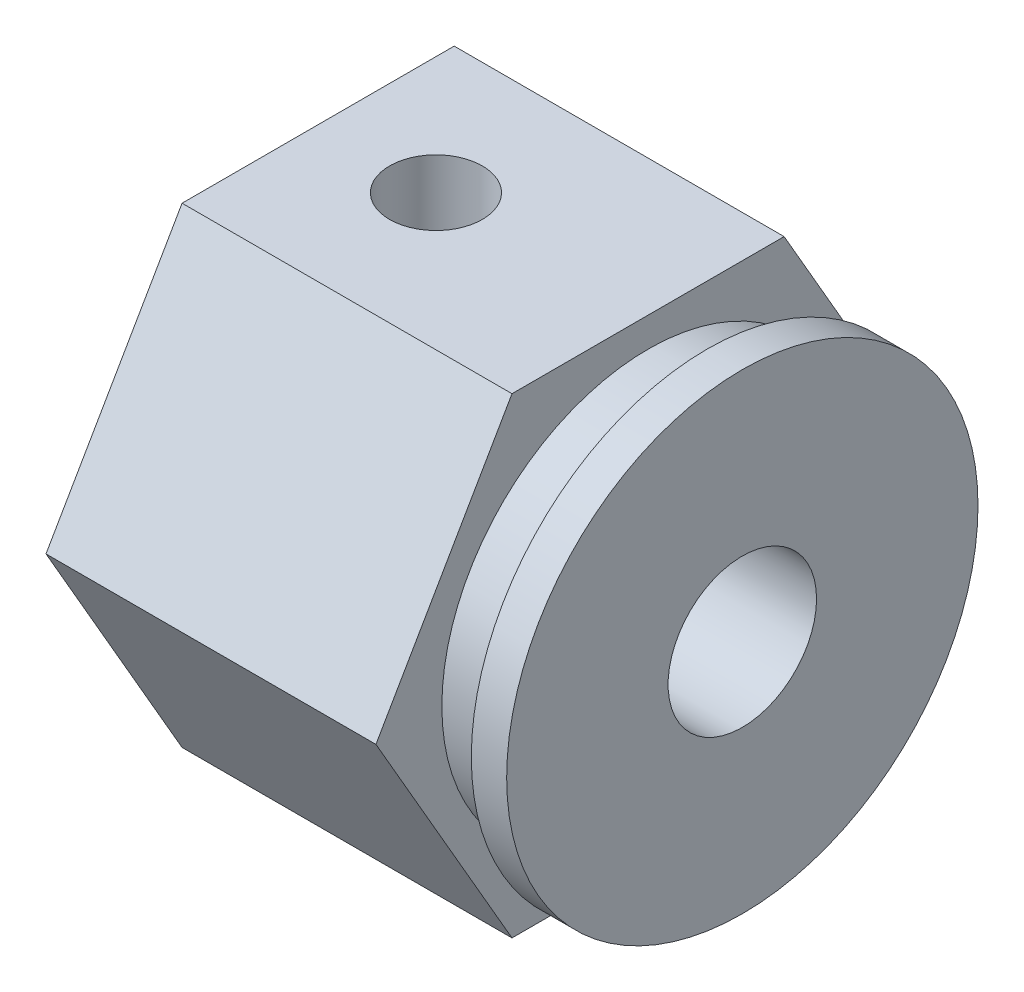
ISO-10303-21;
HEADER;
FILE_DESCRIPTION(('STEP AP214'),'2;1');
FILE_NAME('part.step','',(''),(''),'','','');
FILE_SCHEMA(('AUTOMOTIVE_DESIGN { 1 0 10303 214 1 1 1 1 }'));
ENDSEC;
DATA;
#1=APPLICATION_CONTEXT('core data for automotive mechanical design processes');
#2=APPLICATION_PROTOCOL_DEFINITION('international standard','automotive_design',2000,#1);
#3=PRODUCT_CONTEXT('',#1,'mechanical');
#4=PRODUCT('Part','Part','',(#3));
#5=PRODUCT_RELATED_PRODUCT_CATEGORY('part','',(#4));
#6=PRODUCT_DEFINITION_FORMATION('','',#4);
#7=PRODUCT_DEFINITION_CONTEXT('part definition',#1,'design');
#8=PRODUCT_DEFINITION('design','',#6,#7);
#9=PRODUCT_DEFINITION_SHAPE('','',#8);
#10=(LENGTH_UNIT() NAMED_UNIT(*) SI_UNIT(.MILLI.,.METRE.));
#11=(NAMED_UNIT(*) PLANE_ANGLE_UNIT() SI_UNIT($,.RADIAN.));
#12=(NAMED_UNIT(*) SI_UNIT($,.STERADIAN.) SOLID_ANGLE_UNIT());
#13=UNCERTAINTY_MEASURE_WITH_UNIT(LENGTH_MEASURE(1.E-05),#10,'distance_accuracy_value','');
#14=(GEOMETRIC_REPRESENTATION_CONTEXT(3) GLOBAL_UNCERTAINTY_ASSIGNED_CONTEXT((#13)) GLOBAL_UNIT_ASSIGNED_CONTEXT((#10,
#11,#12)) REPRESENTATION_CONTEXT('',''));
#15=CARTESIAN_POINT('',(0.,0.,0.));
#16=DIRECTION('',(0.,0.,1.));
#17=DIRECTION('',(1.,0.,0.));
#18=AXIS2_PLACEMENT_3D('',#15,#16,#17);
#19=CARTESIAN_POINT('',(8.89,-6.34999999999993,-3.66617420935418));
#20=DIRECTION('',(0.,0.499999999999995,0.866025403784442));
#21=DIRECTION('',(0.,-0.866025403784442,0.499999999999995));
#22=AXIS2_PLACEMENT_3D('',#19,#20,#21);
#23=PLANE('',#22);
#24=DIRECTION('',(0.,0.866025403784442,-0.499999999999995));
#25=VECTOR('',#24,1.);
#26=CARTESIAN_POINT('',(0.,-6.34999999999993,-3.66617420935418));
#27=LINE('',#26,#25);
#28=CARTESIAN_POINT('',(0.,-6.34999999999993,-3.66617420935418));
#29=VERTEX_POINT('',#28);
#30=CARTESIAN_POINT('',(0.,0.,-7.33234841870822));
#31=VERTEX_POINT('',#30);
#32=EDGE_CURVE('E123',#29,#31,#27,.T.);
#33=ORIENTED_EDGE('',*,*,#32,.T.);
#34=DIRECTION('',(-1.,0.,0.));
#35=VECTOR('',#34,1.);
#36=CARTESIAN_POINT('',(8.89,0.,-7.33234841870822));
#37=LINE('',#36,#35);
#38=CARTESIAN_POINT('',(8.89,0.,-7.33234841870822));
#39=VERTEX_POINT('',#38);
#40=EDGE_CURVE('E11',#39,#31,#37,.T.);
#41=ORIENTED_EDGE('',*,*,#40,.F.);
#42=DIRECTION('',(0.,0.866025403784442,-0.499999999999995));
#43=VECTOR('',#42,1.);
#44=CARTESIAN_POINT('',(8.89,-6.34999999999993,-3.66617420935418));
#45=LINE('',#44,#43);
#46=CARTESIAN_POINT('',(8.89,-6.34999999999993,-3.66617420935418));
#47=VERTEX_POINT('',#46);
#48=EDGE_CURVE('E90',#47,#39,#45,.T.);
#49=ORIENTED_EDGE('',*,*,#48,.F.);
#50=DIRECTION('',(-1.,0.,0.));
#51=VECTOR('',#50,1.);
#52=CARTESIAN_POINT('',(8.89,-6.34999999999993,-3.66617420935418));
#53=LINE('',#52,#51);
#54=EDGE_CURVE('E119',#47,#29,#53,.T.);
#55=ORIENTED_EDGE('',*,*,#54,.T.);
#56=EDGE_LOOP('',(#33,#41,#49,#55));
#57=FACE_BOUND('',#56,.T.);
#58=ADVANCED_FACE('F32',(#57),#23,.F.);
#59=CARTESIAN_POINT('',(8.89,0.,-7.33234841870822));
#60=DIRECTION('',(0.,-0.500000000000001,0.866025403784438));
#61=DIRECTION('',(0.,-0.866025403784438,-0.500000000000001));
#62=AXIS2_PLACEMENT_3D('',#59,#60,#61);
#63=PLANE('',#62);
#64=DIRECTION('',(0.,0.866025403784438,0.500000000000001));
#65=VECTOR('',#64,1.);
#66=CARTESIAN_POINT('',(0.,0.,-7.33234841870822));
#67=LINE('',#66,#65);
#68=CARTESIAN_POINT('',(0.,6.34999999999998,-3.66617420935409));
#69=VERTEX_POINT('',#68);
#70=EDGE_CURVE('E126',#31,#69,#67,.T.);
#71=ORIENTED_EDGE('',*,*,#70,.T.);
#72=DIRECTION('',(-1.,0.,0.));
#73=VECTOR('',#72,1.);
#74=CARTESIAN_POINT('',(8.89,6.34999999999998,-3.66617420935409));
#75=LINE('',#74,#73);
#76=CARTESIAN_POINT('',(8.89,6.34999999999998,-3.66617420935409));
#77=VERTEX_POINT('',#76);
#78=EDGE_CURVE('E46',#77,#69,#75,.T.);
#79=ORIENTED_EDGE('',*,*,#78,.F.);
#80=DIRECTION('',(0.,0.866025403784438,0.500000000000001));
#81=VECTOR('',#80,1.);
#82=CARTESIAN_POINT('',(8.89,0.,-7.33234841870822));
#83=LINE('',#82,#81);
#84=EDGE_CURVE('E173',#39,#77,#83,.T.);
#85=ORIENTED_EDGE('',*,*,#84,.F.);
#86=ORIENTED_EDGE('',*,*,#40,.T.);
#87=EDGE_LOOP('',(#71,#79,#85,#86));
#88=FACE_BOUND('',#87,.T.);
#89=ADVANCED_FACE('F160',(#88),#63,.F.);
#90=CARTESIAN_POINT('',(8.89,6.34999999999998,-3.66617420935409));
#91=DIRECTION('',(0.,-1.,0.));
#92=DIRECTION('',(0.,0.,-1.));
#93=AXIS2_PLACEMENT_3D('',#90,#91,#92);
#94=PLANE('',#93);
#95=CARTESIAN_POINT('',(3.175,6.34999999999997,0.));
#96=DIRECTION('',(0.,1.,0.));
#97=DIRECTION('',(0.,0.,1.));
#98=AXIS2_PLACEMENT_3D('',#95,#96,#97);
#99=CIRCLE('',#98,1.25);
#100=CARTESIAN_POINT('',(3.175,6.34999999999997,1.25000000000002));
#101=VERTEX_POINT('',#100);
#102=EDGE_CURVE('E143',#101,#101,#99,.T.);
#103=ORIENTED_EDGE('',*,*,#102,.F.);
#104=EDGE_LOOP('',(#103));
#105=FACE_BOUND('',#104,.T.);
#106=DIRECTION('',(0.,0.,1.));
#107=VECTOR('',#106,1.);
#108=CARTESIAN_POINT('',(0.,6.34999999999998,-3.66617420935409));
#109=LINE('',#108,#107);
#110=CARTESIAN_POINT('',(0.,6.34999999999996,3.66617420935414));
#111=VERTEX_POINT('',#110);
#112=EDGE_CURVE('E129',#69,#111,#109,.T.);
#113=ORIENTED_EDGE('',*,*,#112,.T.);
#114=DIRECTION('',(-1.,0.,0.));
#115=VECTOR('',#114,1.);
#116=CARTESIAN_POINT('',(8.89,6.34999999999996,3.66617420935414));
#117=LINE('',#116,#115);
#118=CARTESIAN_POINT('',(8.89,6.34999999999996,3.66617420935414));
#119=VERTEX_POINT('',#118);
#120=EDGE_CURVE('E114',#119,#111,#117,.T.);
#121=ORIENTED_EDGE('',*,*,#120,.F.);
#122=DIRECTION('',(0.,0.,1.));
#123=VECTOR('',#122,1.);
#124=CARTESIAN_POINT('',(8.89,6.34999999999998,-3.66617420935409));
#125=LINE('',#124,#123);
#126=EDGE_CURVE('E105',#77,#119,#125,.T.);
#127=ORIENTED_EDGE('',*,*,#126,.F.);
#128=ORIENTED_EDGE('',*,*,#78,.T.);
#129=EDGE_LOOP('',(#113,#121,#127,#128));
#130=FACE_BOUND('',#129,.T.);
#131=ADVANCED_FACE('F165',(#105,#130),#94,.F.);
#132=CARTESIAN_POINT('',(8.89,6.34999999999996,3.66617420935414));
#133=DIRECTION('',(0.,-0.499999999999995,-0.866025403784441));
#134=DIRECTION('',(0.,0.866025403784442,-0.499999999999995));
#135=AXIS2_PLACEMENT_3D('',#132,#133,#134);
#136=PLANE('',#135);
#137=DIRECTION('',(0.,-0.866025403784441,0.499999999999995));
#138=VECTOR('',#137,1.);
#139=CARTESIAN_POINT('',(0.,6.34999999999996,3.66617420935414));
#140=LINE('',#139,#138);
#141=CARTESIAN_POINT('',(0.,0.,7.33234841870822));
#142=VERTEX_POINT('',#141);
#143=EDGE_CURVE('E113',#111,#142,#140,.T.);
#144=ORIENTED_EDGE('',*,*,#143,.T.);
#145=DIRECTION('',(-1.,0.,0.));
#146=VECTOR('',#145,1.);
#147=CARTESIAN_POINT('',(8.89,0.,7.33234841870822));
#148=LINE('',#147,#146);
#149=CARTESIAN_POINT('',(8.89,0.,7.33234841870822));
#150=VERTEX_POINT('',#149);
#151=EDGE_CURVE('E110',#150,#142,#148,.T.);
#152=ORIENTED_EDGE('',*,*,#151,.F.);
#153=DIRECTION('',(0.,-0.866025403784441,0.499999999999995));
#154=VECTOR('',#153,1.);
#155=CARTESIAN_POINT('',(8.89,6.34999999999996,3.66617420935414));
#156=LINE('',#155,#154);
#157=EDGE_CURVE('E98',#119,#150,#156,.T.);
#158=ORIENTED_EDGE('',*,*,#157,.F.);
#159=ORIENTED_EDGE('',*,*,#120,.T.);
#160=EDGE_LOOP('',(#144,#152,#158,#159));
#161=FACE_BOUND('',#160,.T.);
#162=ADVANCED_FACE('F111',(#161),#136,.F.);
#163=CARTESIAN_POINT('',(8.89,0.,7.33234841870822));
#164=DIRECTION('',(0.,0.500000000000007,-0.866025403784434));
#165=DIRECTION('',(0.,0.866025403784435,0.500000000000007));
#166=AXIS2_PLACEMENT_3D('',#163,#164,#165);
#167=PLANE('',#166);
#168=DIRECTION('',(0.,-0.866025403784434,-0.500000000000007));
#169=VECTOR('',#168,1.);
#170=CARTESIAN_POINT('',(0.,0.,7.33234841870822));
#171=LINE('',#170,#169);
#172=CARTESIAN_POINT('',(0.,-6.35000000000001,3.66617420935405));
#173=VERTEX_POINT('',#172);
#174=EDGE_CURVE('E78',#142,#173,#171,.T.);
#175=ORIENTED_EDGE('',*,*,#174,.T.);
#176=DIRECTION('',(-1.,0.,0.));
#177=VECTOR('',#176,1.);
#178=CARTESIAN_POINT('',(8.89,-6.35000000000001,3.66617420935405));
#179=LINE('',#178,#177);
#180=CARTESIAN_POINT('',(8.89,-6.35000000000001,3.66617420935405));
#181=VERTEX_POINT('',#180);
#182=EDGE_CURVE('E115',#181,#173,#179,.T.);
#183=ORIENTED_EDGE('',*,*,#182,.F.);
#184=DIRECTION('',(0.,-0.866025403784434,-0.500000000000007));
#185=VECTOR('',#184,1.);
#186=CARTESIAN_POINT('',(8.89,0.,7.33234841870822));
#187=LINE('',#186,#185);
#188=EDGE_CURVE('E103',#150,#181,#187,.T.);
#189=ORIENTED_EDGE('',*,*,#188,.F.);
#190=ORIENTED_EDGE('',*,*,#151,.T.);
#191=EDGE_LOOP('',(#175,#183,#189,#190));
#192=FACE_BOUND('',#191,.T.);
#193=ADVANCED_FACE('F117',(#192),#167,.F.);
#194=CARTESIAN_POINT('',(8.89,-6.35000000000001,3.66617420935405));
#195=DIRECTION('',(0.,1.,0.));
#196=DIRECTION('',(0.,0.,1.));
#197=AXIS2_PLACEMENT_3D('',#194,#195,#196);
#198=PLANE('',#197);
#199=CARTESIAN_POINT('',(3.175,-6.35000000000004,0.));
#200=DIRECTION('',(0.,1.,0.));
#201=DIRECTION('',(0.,0.,1.));
#202=AXIS2_PLACEMENT_3D('',#199,#200,#201);
#203=CIRCLE('',#202,1.25);
#204=CARTESIAN_POINT('',(3.175,-6.35000000000004,1.24999999999998));
#205=VERTEX_POINT('',#204);
#206=EDGE_CURVE('E196',#205,#205,#203,.T.);
#207=ORIENTED_EDGE('',*,*,#206,.T.);
#208=EDGE_LOOP('',(#207));
#209=FACE_BOUND('',#208,.T.);
#210=DIRECTION('',(0.,0.,-1.));
#211=VECTOR('',#210,1.);
#212=CARTESIAN_POINT('',(0.,-6.35000000000001,3.66617420935405));
#213=LINE('',#212,#211);
#214=EDGE_CURVE('E84',#173,#29,#213,.T.);
#215=ORIENTED_EDGE('',*,*,#214,.T.);
#216=ORIENTED_EDGE('',*,*,#54,.F.);
#217=DIRECTION('',(0.,0.,-1.));
#218=VECTOR('',#217,1.);
#219=CARTESIAN_POINT('',(8.89,-6.35000000000001,3.66617420935405));
#220=LINE('',#219,#218);
#221=EDGE_CURVE('E55',#181,#47,#220,.T.);
#222=ORIENTED_EDGE('',*,*,#221,.F.);
#223=ORIENTED_EDGE('',*,*,#182,.T.);
#224=EDGE_LOOP('',(#215,#216,#222,#223));
#225=FACE_BOUND('',#224,.T.);
#226=ADVANCED_FACE('F199',(#209,#225),#198,.F.);
#227=CARTESIAN_POINT('',(8.89,0.,0.));
#228=DIRECTION('',(1.,0.,0.));
#229=DIRECTION('',(0.,0.,-1.));
#230=AXIS2_PLACEMENT_3D('',#227,#228,#229);
#231=PLANE('',#230);
#232=ORIENTED_EDGE('',*,*,#84,.T.);
#233=ORIENTED_EDGE('',*,*,#126,.T.);
#234=ORIENTED_EDGE('',*,*,#157,.T.);
#235=ORIENTED_EDGE('',*,*,#188,.T.);
#236=ORIENTED_EDGE('',*,*,#221,.T.);
#237=ORIENTED_EDGE('',*,*,#48,.T.);
#238=EDGE_LOOP('',(#232,#233,#234,#235,#236,#237));
#239=FACE_BOUND('',#238,.T.);
#240=CARTESIAN_POINT('',(8.89,0.,0.));
#241=DIRECTION('',(-1.,0.,0.));
#242=DIRECTION('',(0.,0.,1.));
#243=AXIS2_PLACEMENT_3D('',#240,#241,#242);
#244=CIRCLE('',#243,5.55624999999996);
#245=CARTESIAN_POINT('',(8.89,0.,5.55624999999996));
#246=VERTEX_POINT('',#245);
#247=EDGE_CURVE('E179',#246,#246,#244,.T.);
#248=ORIENTED_EDGE('',*,*,#247,.T.);
#249=EDGE_LOOP('',(#248));
#250=FACE_BOUND('',#249,.T.);
#251=ADVANCED_FACE('F100',(#239,#250),#231,.T.);
#252=CARTESIAN_POINT('',(0.,0.,0.));
#253=DIRECTION('',(1.,0.,0.));
#254=DIRECTION('',(0.,0.,-1.));
#255=AXIS2_PLACEMENT_3D('',#252,#253,#254);
#256=PLANE('',#255);
#257=CARTESIAN_POINT('',(0.,0.,0.));
#258=DIRECTION('',(1.,0.,0.));
#259=DIRECTION('',(0.,0.,-1.));
#260=AXIS2_PLACEMENT_3D('',#257,#258,#259);
#261=CIRCLE('',#260,2.);
#262=CARTESIAN_POINT('',(0.,0.,-2.));
#263=VERTEX_POINT('',#262);
#264=EDGE_CURVE('E188',#263,#263,#261,.F.);
#265=ORIENTED_EDGE('',*,*,#264,.F.);
#266=EDGE_LOOP('',(#265));
#267=FACE_BOUND('',#266,.T.);
#268=ORIENTED_EDGE('',*,*,#32,.F.);
#269=ORIENTED_EDGE('',*,*,#214,.F.);
#270=ORIENTED_EDGE('',*,*,#174,.F.);
#271=ORIENTED_EDGE('',*,*,#143,.F.);
#272=ORIENTED_EDGE('',*,*,#112,.F.);
#273=ORIENTED_EDGE('',*,*,#70,.F.);
#274=EDGE_LOOP('',(#268,#269,#270,#271,#272,#273));
#275=FACE_BOUND('',#274,.T.);
#276=ADVANCED_FACE('F170',(#267,#275),#256,.F.);
#277=CARTESIAN_POINT('',(0.,0.,0.));
#278=DIRECTION('',(-1.,0.,0.));
#279=DIRECTION('',(0.,0.,1.));
#280=AXIS2_PLACEMENT_3D('',#277,#278,#279);
#281=CYLINDRICAL_SURFACE('',#280,5.55624999999996);
#282=CARTESIAN_POINT('',(10.4775,0.,0.));
#283=DIRECTION('',(-1.,0.,0.));
#284=DIRECTION('',(0.,0.,1.));
#285=AXIS2_PLACEMENT_3D('',#282,#283,#284);
#286=CIRCLE('',#285,5.55624999999996);
#287=CARTESIAN_POINT('',(10.4775,0.,5.55624999999996));
#288=VERTEX_POINT('',#287);
#289=EDGE_CURVE('E182',#288,#288,#286,.T.);
#290=ORIENTED_EDGE('',*,*,#289,.T.);
#291=EDGE_LOOP('',(#290));
#292=FACE_BOUND('',#291,.T.);
#293=ORIENTED_EDGE('',*,*,#247,.F.);
#294=EDGE_LOOP('',(#293));
#295=FACE_BOUND('',#294,.T.);
#296=ADVANCED_FACE('F230',(#292,#295),#281,.T.);
#297=CARTESIAN_POINT('',(10.4775,6.34999999999996,0.));
#298=DIRECTION('',(-1.,0.,0.));
#299=DIRECTION('',(0.,0.,1.));
#300=AXIS2_PLACEMENT_3D('',#297,#298,#299);
#301=PLANE('',#300);
#302=CARTESIAN_POINT('',(10.4775,0.,0.));
#303=DIRECTION('',(-1.,0.,0.));
#304=DIRECTION('',(0.,0.,1.));
#305=AXIS2_PLACEMENT_3D('',#302,#303,#304);
#306=CIRCLE('',#305,6.34999999999996);
#307=CARTESIAN_POINT('',(10.4775,0.,6.34999999999996));
#308=VERTEX_POINT('',#307);
#309=EDGE_CURVE('E185',#308,#308,#306,.T.);
#310=ORIENTED_EDGE('',*,*,#309,.T.);
#311=EDGE_LOOP('',(#310));
#312=FACE_BOUND('',#311,.T.);
#313=ORIENTED_EDGE('',*,*,#289,.F.);
#314=EDGE_LOOP('',(#313));
#315=FACE_BOUND('',#314,.T.);
#316=ADVANCED_FACE('F234',(#312,#315),#301,.T.);
#317=CARTESIAN_POINT('',(11.43,0.,0.));
#318=DIRECTION('',(1.,0.,0.));
#319=DIRECTION('',(0.,0.,-1.));
#320=AXIS2_PLACEMENT_3D('',#317,#318,#319);
#321=PLANE('',#320);
#322=CARTESIAN_POINT('',(11.43,0.,0.));
#323=DIRECTION('',(1.,0.,0.));
#324=DIRECTION('',(0.,0.,-1.));
#325=AXIS2_PLACEMENT_3D('',#322,#323,#324);
#326=CIRCLE('',#325,2.);
#327=CARTESIAN_POINT('',(11.43,0.,-2.));
#328=VERTEX_POINT('',#327);
#329=EDGE_CURVE('E191',#328,#328,#326,.T.);
#330=ORIENTED_EDGE('',*,*,#329,.F.);
#331=EDGE_LOOP('',(#330));
#332=FACE_BOUND('',#331,.T.);
#333=CARTESIAN_POINT('',(11.43,0.,0.));
#334=DIRECTION('',(1.,0.,0.));
#335=DIRECTION('',(0.,0.,-1.));
#336=AXIS2_PLACEMENT_3D('',#333,#334,#335);
#337=CIRCLE('',#336,6.34999999999997);
#338=CARTESIAN_POINT('',(11.43,0.,-6.34999999999997));
#339=VERTEX_POINT('',#338);
#340=EDGE_CURVE('E127',#339,#339,#337,.T.);
#341=ORIENTED_EDGE('',*,*,#340,.T.);
#342=EDGE_LOOP('',(#341));
#343=FACE_BOUND('',#342,.T.);
#344=ADVANCED_FACE('F240',(#332,#343),#321,.T.);
#345=CARTESIAN_POINT('',(11.43,0.,0.));
#346=DIRECTION('',(-1.,0.,0.));
#347=DIRECTION('',(0.,0.,1.));
#348=AXIS2_PLACEMENT_3D('',#345,#346,#347);
#349=CYLINDRICAL_SURFACE('',#348,6.34999999999997);
#350=ORIENTED_EDGE('',*,*,#340,.F.);
#351=EDGE_LOOP('',(#350));
#352=FACE_BOUND('',#351,.T.);
#353=ORIENTED_EDGE('',*,*,#309,.F.);
#354=EDGE_LOOP('',(#353));
#355=FACE_BOUND('',#354,.T.);
#356=ADVANCED_FACE('F223',(#352,#355),#349,.T.);
#357=CARTESIAN_POINT('',(-0.000999999999999265,0.,0.));
#358=DIRECTION('',(1.,0.,0.));
#359=DIRECTION('',(0.,0.,-1.));
#360=AXIS2_PLACEMENT_3D('',#357,#358,#359);
#361=CYLINDRICAL_SURFACE('',#360,2.);
#362=CARTESIAN_POINT('',(3.175,-1.5612494995996,1.24999999999999));
#363=CARTESIAN_POINT('',(3.11287971819707,-1.56125800072559,1.24999462210484));
#364=CARTESIAN_POINT('',(3.05066216462974,-1.56502642708837,1.24532693849665));
#365=CARTESIAN_POINT('',(2.92832367992062,-1.57943717205478,1.22698950832934));
#366=CARTESIAN_POINT('',(2.86820891363476,-1.59009816464115,1.2132953043055));
#367=CARTESIAN_POINT('',(2.75221767730116,-1.61650085329041,1.1778807391187));
#368=CARTESIAN_POINT('',(2.69630939131819,-1.63219837418033,1.15622993332784));
#369=CARTESIAN_POINT('',(2.58899113836185,-1.66682950714433,1.10571945561924));
#370=CARTESIAN_POINT('',(2.5375812941435,-1.68576320748676,1.07685958706091));
#371=CARTESIAN_POINT('',(2.43313484552302,-1.72779611374712,1.00823937928364));
#372=CARTESIAN_POINT('',(2.38080525916741,-1.75111338227347,0.967536093692496));
#373=CARTESIAN_POINT('',(2.28311730085503,-1.79752820854877,0.878308664496873));
#374=CARTESIAN_POINT('',(2.23776500271608,-1.82062555863329,0.829777781297407));
#375=CARTESIAN_POINT('',(2.14989641485188,-1.8672945389101,0.719186665258485));
#376=CARTESIAN_POINT('',(2.1083823318957,-1.8905872224145,0.65620056891055));
#377=CARTESIAN_POINT('',(2.03687479523684,-1.9318323169914,0.522404070837309));
#378=CARTESIAN_POINT('',(2.00686993424875,-1.94979001179838,0.451601506478235));
#379=CARTESIAN_POINT('',(1.96251768939294,-1.97669841318201,0.311776878362012));
#380=CARTESIAN_POINT('',(1.94688858360306,-1.98637922422038,0.243305636047235));
#381=CARTESIAN_POINT('',(1.9273679303566,-1.99850544379202,0.104105100662257));
#382=CARTESIAN_POINT('',(1.92346404387945,-2.00095845843657,0.0333782605640202));
#383=CARTESIAN_POINT('',(1.92735568927761,-1.99852909107527,-0.0980658284213469));
#384=CARTESIAN_POINT('',(1.9336513763009,-1.99458699811902,-0.158852523273793));
#385=CARTESIAN_POINT('',(1.95486698436332,-1.98145272261225,-0.278306645903676));
#386=CARTESIAN_POINT('',(1.96978755723752,-1.97226014325117,-0.336973913146981));
#387=CARTESIAN_POINT('',(2.00760377509712,-1.94938133614675,-0.450889117077079));
#388=CARTESIAN_POINT('',(2.03051982404859,-1.93568361673912,-0.506127875493239));
#389=CARTESIAN_POINT('',(2.08346875525999,-1.90485632889331,-0.612019220469388));
#390=CARTESIAN_POINT('',(2.1135032588906,-1.88772597874226,-0.662670758560007));
#391=CARTESIAN_POINT('',(2.18402816532937,-1.84893224750793,-0.764713515567048));
#392=CARTESIAN_POINT('',(2.22535462674233,-1.82697004307144,-0.815412344918956));
#393=CARTESIAN_POINT('',(2.31513238022337,-1.78195462752237,-0.909598595905505));
#394=CARTESIAN_POINT('',(2.36359402644655,-1.75889986449171,-0.953075338789638));
#395=CARTESIAN_POINT('',(2.4737056229061,-1.71071442112195,-1.03735445892932));
#396=CARTESIAN_POINT('',(2.5362513808503,-1.68570581533194,-1.07706615479947));
#397=CARTESIAN_POINT('',(2.66864611977342,-1.64014139095399,-1.14526153203309));
#398=CARTESIAN_POINT('',(2.73848134395541,-1.61957740191679,-1.17376589603359));
#399=CARTESIAN_POINT('',(2.86476940288787,-1.5909187656712,-1.21218566853167));
#400=CARTESIAN_POINT('',(2.91991096263767,-1.58096704305272,-1.22501841721721));
#401=CARTESIAN_POINT('',(3.03211518874893,-1.56679138875765,-1.24310168537524));
#402=CARTESIAN_POINT('',(3.0891751210399,-1.56255963237428,-1.24836256353275));
#403=CARTESIAN_POINT('',(3.20372868054027,-1.56046133530164,-1.25098535954509));
#404=CARTESIAN_POINT('',(3.26122300136582,-1.56260938140435,-1.24832917576577));
#405=CARTESIAN_POINT('',(3.3747805810316,-1.57296042862704,-1.23525733555988));
#406=CARTESIAN_POINT('',(3.43084261496292,-1.58116844404656,-1.22483525320262));
#407=CARTESIAN_POINT('',(3.5392183838658,-1.60230060601957,-1.19704935724831));
#408=CARTESIAN_POINT('',(3.59157867333151,-1.61514477937171,-1.17980280626789));
#409=CARTESIAN_POINT('',(3.69278733455698,-1.64415573440841,-1.13902451938523));
#410=CARTESIAN_POINT('',(3.74163445202449,-1.66032369489908,-1.11549055271422));
#411=CARTESIAN_POINT('',(3.84430603917703,-1.69787203988936,-1.0576537677232));
#412=CARTESIAN_POINT('',(3.89730754124932,-1.71965875738289,-1.02215373814221));
#413=CARTESIAN_POINT('',(3.99718505243915,-1.76393958000711,-0.94369026322487));
#414=CARTESIAN_POINT('',(4.04405461697796,-1.78643439903354,-0.900719074496609));
#415=CARTESIAN_POINT('',(4.13798324624315,-1.83383164018972,-0.800380659499203));
#416=CARTESIAN_POINT('',(4.18386855700768,-1.85854204787597,-0.741809949714172));
#417=CARTESIAN_POINT('',(4.26506865187585,-1.90384248964999,-0.616299987869586));
#418=CARTESIAN_POINT('',(4.30038838997364,-1.92443445329132,-0.549364678748671));
#419=CARTESIAN_POINT('',(4.35699499120264,-1.95809255957561,-0.412925900636608));
#420=CARTESIAN_POINT('',(4.37899420647076,-1.9715348458918,-0.343814822544528));
#421=CARTESIAN_POINT('',(4.41072666868109,-1.9910701008804,-0.201860998884755));
#422=CARTESIAN_POINT('',(4.42047688976111,-1.99717323933003,-0.129023563238375));
#423=CARTESIAN_POINT('',(4.42654652003878,-2.00096685748559,0.00659907199680378));
#424=CARTESIAN_POINT('',(4.42463577678698,-1.99976600623617,0.0692812975954656));
#425=CARTESIAN_POINT('',(4.41153832502566,-1.99160739958772,0.193279811091717));
#426=CARTESIAN_POINT('',(4.40035203742423,-1.98464990541518,0.254596160840735));
#427=CARTESIAN_POINT('',(4.36983952512341,-1.9659610468898,0.372043294685518));
#428=CARTESIAN_POINT('',(4.3508091601268,-1.95440367471701,0.428280180678301));
#429=CARTESIAN_POINT('',(4.30544007183594,-1.92744968677265,0.536714369111307));
#430=CARTESIAN_POINT('',(4.27910011552441,-1.91205242331406,0.588910988118232));
#431=CARTESIAN_POINT('',(4.2168394210088,-1.87675342239825,0.693656737470659));
#432=CARTESIAN_POINT('',(4.18020801868102,-1.85655002466956,0.745680127162204));
#433=CARTESIAN_POINT('',(4.0999233696673,-1.81433640456238,0.843216608355406));
#434=CARTESIAN_POINT('',(4.05626219975406,-1.79232415730621,0.888722243055223));
#435=CARTESIAN_POINT('',(3.95588373769673,-1.74500415099525,0.978723601300798));
#436=CARTESIAN_POINT('',(3.89819165482308,-1.71967871446314,1.02212829873815));
#437=CARTESIAN_POINT('',(3.77535533398988,-1.67174821497037,1.09877325005743));
#438=CARTESIAN_POINT('',(3.7102152450924,-1.64914165167052,1.13201912557099));
#439=CARTESIAN_POINT('',(3.58859723207033,-1.61429776080214,1.1809911092323));
#440=CARTESIAN_POINT('',(3.53336431912064,-1.60087340349653,1.1989621627638));
#441=CARTESIAN_POINT('',(3.42003072204281,-1.5793915843794,1.22712822180407));
#442=CARTESIAN_POINT('',(3.36193974497586,-1.57131714400176,1.23734784245404));
#443=CARTESIAN_POINT('',(3.28196947613715,-1.56476456389395,1.24559906183097));
#444=CARTESIAN_POINT('',(3.26063585448301,-1.56345069546827,1.2472467125958));
#445=CARTESIAN_POINT('',(3.21787203347851,-1.56169158695047,1.24944824734287));
#446=CARTESIAN_POINT('',(3.19644181119832,-1.56124656529968,1.25000185626673));
#447=CARTESIAN_POINT('',(3.175,-1.5612494995996,1.24999999999999));
#448=B_SPLINE_CURVE_WITH_KNOTS('',3,(#362,#363,#364,#365,#366,#367,#368,#369,#370,#371,#372,
#373,#374,#375,#376,#377,#378,#379,#380,#381,#382,#383,#384,#385,#386,#387,#388,#389,#390,#391,
#392,#393,#394,#395,#396,#397,#398,#399,#400,#401,#402,#403,#404,#405,#406,#407,#408,#409,#410,
#411,#412,#413,#414,#415,#416,#417,#418,#419,#420,#421,#422,#423,#424,#425,#426,#427,#428,#429,
#430,#431,#432,#433,#434,#435,#436,#437,#438,#439,#440,#441,#442,#443,#444,#445,#446,#447),
.UNSPECIFIED.,.T.,.F.,(4,2,2,2,2,2,2,2,2,2,2,2,2,2,2,2,2,2,2,2,2,2,2,2,2,2,2,2,2,2,2,2,2,2,2,2,
2,2,2,2,2,2,4),(0.,0.186262444012014,0.373031654397096,0.558205556130402,0.74338450937775,
0.953406207440073,1.16360970997911,1.39917236034456,1.6345009273926,1.84590412815398,
2.05708478092387,2.23992319583511,2.42277543076414,2.60609774825956,2.78946186128171,
2.99564504832107,3.20213044016186,3.43558067920821,3.66859805095277,3.84032775480268,
4.01182230007289,4.18370925240739,4.35573859160081,4.52493212343598,4.69418576487135,
4.89566333610128,5.09735098485253,5.33136598660889,5.56527109061626,5.78520080494549,
6.00482541258961,6.19203601525124,6.37923812308582,6.55994569114423,6.7406837603788,
6.94018144108745,7.13990556958867,7.36841817421248,7.59680409585386,7.77496902270412,
7.95256577963385,8.01684109069498,8.08113255947022),.UNSPECIFIED.);
#449=CARTESIAN_POINT('',(3.175,-1.5612494995996,1.24999999999999));
#450=VERTEX_POINT('',#449);
#451=EDGE_CURVE('E35',#450,#450,#448,.T.);
#452=ORIENTED_EDGE('',*,*,#451,.T.);
#453=EDGE_LOOP('',(#452));
#454=FACE_BOUND('',#453,.T.);
#455=CARTESIAN_POINT('',(3.175,1.56124949959959,1.25000000000001));
#456=CARTESIAN_POINT('',(3.23712028180293,1.56125800072558,1.24999462210486));
#457=CARTESIAN_POINT('',(3.29933783537026,1.56502642708836,1.24532693849666));
#458=CARTESIAN_POINT('',(3.42167632007938,1.57943717205477,1.22698950832935));
#459=CARTESIAN_POINT('',(3.48179108636524,1.59009816464114,1.21329530430551));
#460=CARTESIAN_POINT('',(3.59778232269884,1.61650085329041,1.17788073911871));
#461=CARTESIAN_POINT('',(3.65369060868181,1.63219837418033,1.15622993332785));
#462=CARTESIAN_POINT('',(3.76100886163815,1.66682950714432,1.10571945561925));
#463=CARTESIAN_POINT('',(3.8124187058565,1.68576320748675,1.07685958706092));
#464=CARTESIAN_POINT('',(3.91686515447698,1.72779611374711,1.00823937928365));
#465=CARTESIAN_POINT('',(3.96919474083259,1.75111338227346,0.967536093692509));
#466=CARTESIAN_POINT('',(4.06688269914497,1.79752820854876,0.878308664496886));
#467=CARTESIAN_POINT('',(4.11223499728392,1.82062555863329,0.82977778129742));
#468=CARTESIAN_POINT('',(4.20010358514812,1.86729453891009,0.719186665258498));
#469=CARTESIAN_POINT('',(4.2416176681043,1.8905872224145,0.656200568910563));
#470=CARTESIAN_POINT('',(4.31312520476316,1.9318323169914,0.522404070837323));
#471=CARTESIAN_POINT('',(4.34313006575125,1.94979001179838,0.451601506478248));
#472=CARTESIAN_POINT('',(4.38748231060706,1.976698413182,0.311776878362026));
#473=CARTESIAN_POINT('',(4.40311141639694,1.98637922422038,0.243305636047248));
#474=CARTESIAN_POINT('',(4.4226320696434,1.99850544379202,0.104105100662271));
#475=CARTESIAN_POINT('',(4.42653595612055,2.00095845843657,0.0333782605640342));
#476=CARTESIAN_POINT('',(4.42264431072239,1.99852909107528,-0.098065828421333));
#477=CARTESIAN_POINT('',(4.4163486236991,1.99458699811902,-0.158852523273779));
#478=CARTESIAN_POINT('',(4.39513301563668,1.98145272261225,-0.278306645903662));
#479=CARTESIAN_POINT('',(4.38021244276248,1.97226014325117,-0.336973913146967));
#480=CARTESIAN_POINT('',(4.34239622490288,1.94938133614675,-0.450889117077066));
#481=CARTESIAN_POINT('',(4.31948017595141,1.93568361673912,-0.506127875493226));
#482=CARTESIAN_POINT('',(4.26653124474001,1.90485632889331,-0.612019220469375));
#483=CARTESIAN_POINT('',(4.2364967411094,1.88772597874227,-0.662670758559994));
#484=CARTESIAN_POINT('',(4.16597183467063,1.84893224750793,-0.764713515567035));
#485=CARTESIAN_POINT('',(4.12464537325767,1.82697004307145,-0.815412344918944));
#486=CARTESIAN_POINT('',(4.03486761977663,1.78195462752237,-0.909598595905492));
#487=CARTESIAN_POINT('',(3.98640597355345,1.75889986449171,-0.953075338789626));
#488=CARTESIAN_POINT('',(3.87629437709389,1.71071442112196,-1.03735445892931));
#489=CARTESIAN_POINT('',(3.8137486191497,1.68570581533195,-1.07706615479946));
#490=CARTESIAN_POINT('',(3.68135388022658,1.640141390954,-1.14526153203308));
#491=CARTESIAN_POINT('',(3.61151865604459,1.6195774019168,-1.17376589603357));
#492=CARTESIAN_POINT('',(3.48523059711213,1.59091876567121,-1.21218566853166));
#493=CARTESIAN_POINT('',(3.43008903736233,1.58096704305273,-1.2250184172172));
#494=CARTESIAN_POINT('',(3.31788481125107,1.56679138875765,-1.24310168537523));
#495=CARTESIAN_POINT('',(3.2608248789601,1.56255963237429,-1.24836256353274));
#496=CARTESIAN_POINT('',(3.14627131945973,1.56046133530165,-1.25098535954508));
#497=CARTESIAN_POINT('',(3.08877699863418,1.56260938140435,-1.24832917576576));
#498=CARTESIAN_POINT('',(2.9752194189684,1.57296042862705,-1.23525733555987));
#499=CARTESIAN_POINT('',(2.91915738503708,1.58116844404657,-1.22483525320261));
#500=CARTESIAN_POINT('',(2.8107816161342,1.60230060601958,-1.19704935724829));
#501=CARTESIAN_POINT('',(2.75842132666849,1.61514477937172,-1.17980280626788));
#502=CARTESIAN_POINT('',(2.65721266544302,1.64415573440842,-1.13902451938522));
#503=CARTESIAN_POINT('',(2.60836554797551,1.66032369489909,-1.1154905527142));
#504=CARTESIAN_POINT('',(2.50569396082297,1.69787203988937,-1.05765376772319));
#505=CARTESIAN_POINT('',(2.45269245875068,1.7196587573829,-1.0221537381422));
#506=CARTESIAN_POINT('',(2.35281494756085,1.76393958000711,-0.943690263224857));
#507=CARTESIAN_POINT('',(2.30594538302204,1.78643439903354,-0.900719074496595));
#508=CARTESIAN_POINT('',(2.21201675375685,1.83383164018973,-0.800380659499188));
#509=CARTESIAN_POINT('',(2.16613144299232,1.85854204787597,-0.741809949714158));
#510=CARTESIAN_POINT('',(2.08493134812414,1.90384248964999,-0.616299987869572));
#511=CARTESIAN_POINT('',(2.04961161002636,1.92443445329133,-0.549364678748656));
#512=CARTESIAN_POINT('',(1.99300500879736,1.95809255957561,-0.412925900636593));
#513=CARTESIAN_POINT('',(1.97100579352924,1.9715348458918,-0.343814822544513));
#514=CARTESIAN_POINT('',(1.93927333131891,1.9910701008804,-0.20186099888474));
#515=CARTESIAN_POINT('',(1.92952311023889,1.99717323933003,-0.12902356323836));
#516=CARTESIAN_POINT('',(1.92345347996122,2.00096685748559,0.00659907199681831));
#517=CARTESIAN_POINT('',(1.92536422321301,1.99976600623617,0.0692812975954801));
#518=CARTESIAN_POINT('',(1.93846167497434,1.99160739958772,0.193279811091732));
#519=CARTESIAN_POINT('',(1.94964796257577,1.98464990541518,0.254596160840749));
#520=CARTESIAN_POINT('',(1.98016047487659,1.9659610468898,0.372043294685533));
#521=CARTESIAN_POINT('',(1.9991908398732,1.95440367471701,0.428280180678315));
#522=CARTESIAN_POINT('',(2.04455992816407,1.92744968677265,0.536714369111321));
#523=CARTESIAN_POINT('',(2.07089988447559,1.91205242331405,0.588910988118246));
#524=CARTESIAN_POINT('',(2.1331605789912,1.87675342239824,0.693656737470672));
#525=CARTESIAN_POINT('',(2.16979198131898,1.85655002466956,0.745680127162217));
#526=CARTESIAN_POINT('',(2.2500766303327,1.81433640456237,0.843216608355419));
#527=CARTESIAN_POINT('',(2.29373780024594,1.7923241573062,0.888722243055235));
#528=CARTESIAN_POINT('',(2.39411626230327,1.74500415099524,0.978723601300811));
#529=CARTESIAN_POINT('',(2.45180834517692,1.71967871446313,1.02212829873817));
#530=CARTESIAN_POINT('',(2.57464466601012,1.67174821497036,1.09877325005745));
#531=CARTESIAN_POINT('',(2.6397847549076,1.64914165167051,1.132019125571));
#532=CARTESIAN_POINT('',(2.76140276792967,1.61429776080213,1.18099110923231));
#533=CARTESIAN_POINT('',(2.81663568087936,1.60087340349652,1.19896216276382));
#534=CARTESIAN_POINT('',(2.92996927795719,1.57939158437939,1.22712822180408));
#535=CARTESIAN_POINT('',(2.98806025502414,1.57131714400175,1.23734784245405));
#536=CARTESIAN_POINT('',(3.06803052386285,1.56476456389394,1.24559906183098));
#537=CARTESIAN_POINT('',(3.08936414551699,1.56345069546826,1.24724671259581));
#538=CARTESIAN_POINT('',(3.13212796652149,1.56169158695046,1.24944824734289));
#539=CARTESIAN_POINT('',(3.15355818880168,1.56124656529967,1.25000185626674));
#540=CARTESIAN_POINT('',(3.175,1.56124949959959,1.25000000000001));
#541=B_SPLINE_CURVE_WITH_KNOTS('',3,(#455,#456,#457,#458,#459,#460,#461,#462,#463,#464,#465,
#466,#467,#468,#469,#470,#471,#472,#473,#474,#475,#476,#477,#478,#479,#480,#481,#482,#483,#484,
#485,#486,#487,#488,#489,#490,#491,#492,#493,#494,#495,#496,#497,#498,#499,#500,#501,#502,#503,
#504,#505,#506,#507,#508,#509,#510,#511,#512,#513,#514,#515,#516,#517,#518,#519,#520,#521,#522,
#523,#524,#525,#526,#527,#528,#529,#530,#531,#532,#533,#534,#535,#536,#537,#538,#539,#540),
.UNSPECIFIED.,.T.,.F.,(4,2,2,2,2,2,2,2,2,2,2,2,2,2,2,2,2,2,2,2,2,2,2,2,2,2,2,2,2,2,2,2,2,2,2,2,
2,2,2,2,2,2,4),(0.,0.186262444012015,0.373031654397096,0.558205556130401,0.74338450937775,
0.953406207440073,1.16360970997911,1.39917236034456,1.6345009273926,1.84590412815398,
2.05708478092387,2.23992319583511,2.42277543076414,2.60609774825956,2.78946186128171,
2.99564504832107,3.20213044016186,3.43558067920821,3.66859805095277,3.84032775480267,
4.01182230007289,4.18370925240739,4.35573859160081,4.52493212343598,4.69418576487135,
4.89566333610128,5.09735098485254,5.33136598660889,5.56527109061626,5.78520080494549,
6.00482541258961,6.19203601525124,6.37923812308583,6.55994569114424,6.74068376037881,
6.94018144108745,7.13990556958868,7.36841817421249,7.59680409585386,7.77496902270413,
7.95256577963385,8.01684109069498,8.08113255947023),.UNSPECIFIED.);
#542=CARTESIAN_POINT('',(3.175,1.56124949959959,1.25000000000001));
#543=VERTEX_POINT('',#542);
#544=EDGE_CURVE('E138',#543,#543,#541,.T.);
#545=ORIENTED_EDGE('',*,*,#544,.T.);
#546=EDGE_LOOP('',(#545));
#547=FACE_BOUND('',#546,.T.);
#548=ORIENTED_EDGE('',*,*,#329,.T.);
#549=EDGE_LOOP('',(#548));
#550=FACE_BOUND('',#549,.T.);
#551=ORIENTED_EDGE('',*,*,#264,.T.);
#552=EDGE_LOOP('',(#551));
#553=FACE_BOUND('',#552,.T.);
#554=ADVANCED_FACE('F144',(#454,#547,#550,#553),#361,.F.);
#555=CARTESIAN_POINT('',(3.175,6.34999999999997,0.));
#556=DIRECTION('',(0.,1.,0.));
#557=DIRECTION('',(0.,0.,1.));
#558=AXIS2_PLACEMENT_3D('',#555,#556,#557);
#559=CYLINDRICAL_SURFACE('',#558,1.25);
#560=ORIENTED_EDGE('',*,*,#102,.T.);
#561=EDGE_LOOP('',(#560));
#562=FACE_BOUND('',#561,.T.);
#563=ORIENTED_EDGE('',*,*,#544,.F.);
#564=EDGE_LOOP('',(#563));
#565=FACE_BOUND('',#564,.T.);
#566=ADVANCED_FACE('F150',(#562,#565),#559,.F.);
#567=ORIENTED_EDGE('',*,*,#206,.F.);
#568=EDGE_LOOP('',(#567));
#569=FACE_BOUND('',#568,.T.);
#570=ORIENTED_EDGE('',*,*,#451,.F.);
#571=EDGE_LOOP('',(#570));
#572=FACE_BOUND('',#571,.T.);
#573=ADVANCED_FACE('F147',(#569,#572),#559,.F.);
#574=CLOSED_SHELL('',(#58,#89,#131,#162,#193,#226,#251,#276,#296,#316,#344,#356,#554,#566,#573));
#575=MANIFOLD_SOLID_BREP('B2',#574);
#576=ADVANCED_BREP_SHAPE_REPRESENTATION('',(#18,#575),#14);
#577=SHAPE_DEFINITION_REPRESENTATION(#9,#576);
ENDSEC;
END-ISO-10303-21;
